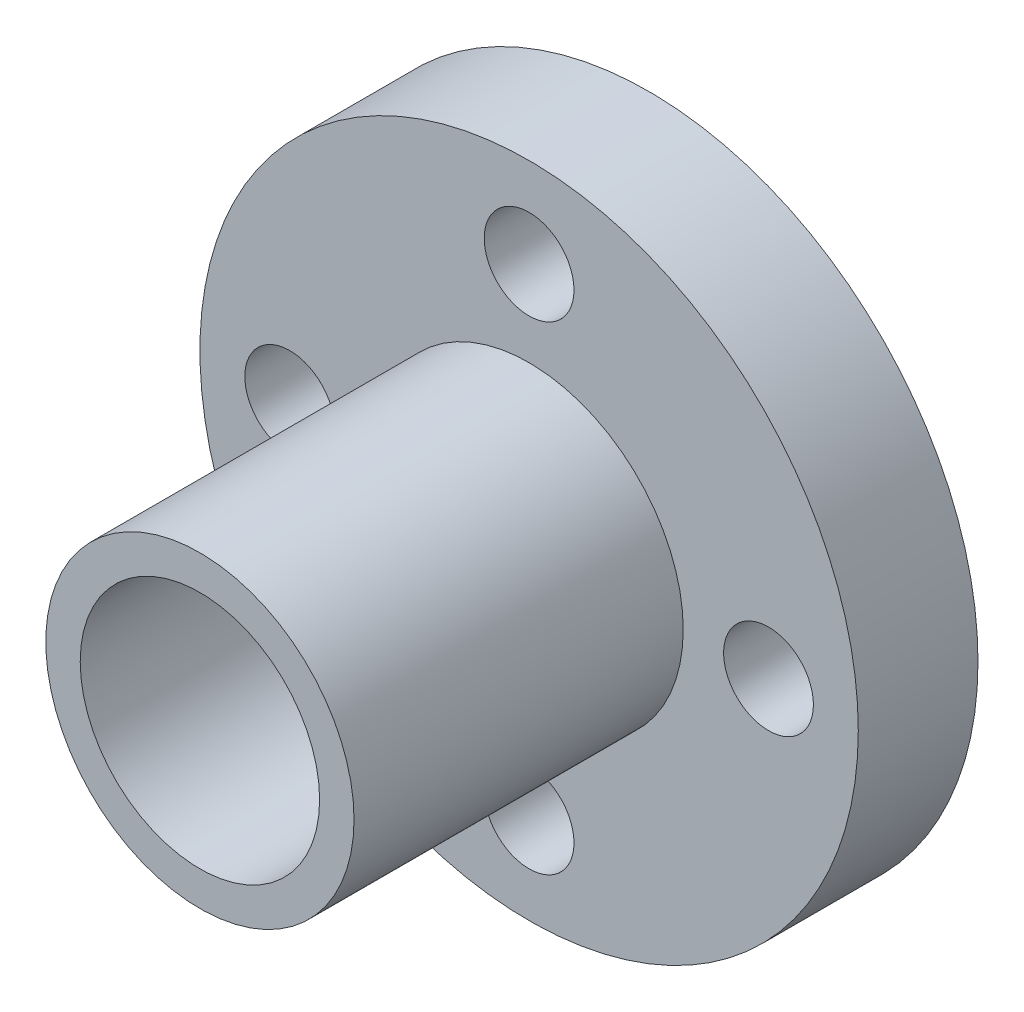
ISO-10303-21;
HEADER;
FILE_DESCRIPTION(('STEP AP214'),'2;1');
FILE_NAME('part.step','',(''),(''),'','','');
FILE_SCHEMA(('AUTOMOTIVE_DESIGN { 1 0 10303 214 1 1 1 1 }'));
ENDSEC;
DATA;
#1=APPLICATION_CONTEXT('core data for automotive mechanical design processes');
#2=APPLICATION_PROTOCOL_DEFINITION('international standard','automotive_design',2000,#1);
#3=PRODUCT_CONTEXT('',#1,'mechanical');
#4=PRODUCT('Part','Part','',(#3));
#5=PRODUCT_RELATED_PRODUCT_CATEGORY('part','',(#4));
#6=PRODUCT_DEFINITION_FORMATION('','',#4);
#7=PRODUCT_DEFINITION_CONTEXT('part definition',#1,'design');
#8=PRODUCT_DEFINITION('design','',#6,#7);
#9=PRODUCT_DEFINITION_SHAPE('','',#8);
#10=(LENGTH_UNIT() NAMED_UNIT(*) SI_UNIT(.MILLI.,.METRE.));
#11=(NAMED_UNIT(*) PLANE_ANGLE_UNIT() SI_UNIT($,.RADIAN.));
#12=(NAMED_UNIT(*) SI_UNIT($,.STERADIAN.) SOLID_ANGLE_UNIT());
#13=UNCERTAINTY_MEASURE_WITH_UNIT(LENGTH_MEASURE(1.E-05),#10,'distance_accuracy_value','');
#14=(GEOMETRIC_REPRESENTATION_CONTEXT(3) GLOBAL_UNCERTAINTY_ASSIGNED_CONTEXT((#13)) GLOBAL_UNIT_ASSIGNED_CONTEXT((#10,
#11,#12)) REPRESENTATION_CONTEXT('',''));
#15=CARTESIAN_POINT('',(0.,0.,0.));
#16=DIRECTION('',(0.,0.,1.));
#17=DIRECTION('',(1.,0.,0.));
#18=AXIS2_PLACEMENT_3D('',#15,#16,#17);
#19=CARTESIAN_POINT('',(0.,0.,4.));
#20=DIRECTION('',(0.,0.,-1.));
#21=DIRECTION('',(-1.,0.,0.));
#22=AXIS2_PLACEMENT_3D('',#19,#20,#21);
#23=CYLINDRICAL_SURFACE('',#22,11.);
#24=CARTESIAN_POINT('',(0.,0.,4.));
#25=DIRECTION('',(0.,0.,1.));
#26=DIRECTION('',(1.,0.,0.));
#27=AXIS2_PLACEMENT_3D('',#24,#25,#26);
#28=CIRCLE('',#27,11.);
#29=CARTESIAN_POINT('',(11.,0.,4.));
#30=VERTEX_POINT('',#29);
#31=EDGE_CURVE('E39',#30,#30,#28,.T.);
#32=ORIENTED_EDGE('',*,*,#31,.F.);
#33=EDGE_LOOP('',(#32));
#34=FACE_BOUND('',#33,.T.);
#35=CARTESIAN_POINT('',(0.,0.,0.));
#36=DIRECTION('',(0.,0.,1.));
#37=DIRECTION('',(1.,0.,0.));
#38=AXIS2_PLACEMENT_3D('',#35,#36,#37);
#39=CIRCLE('',#38,11.);
#40=CARTESIAN_POINT('',(11.,0.,0.));
#41=VERTEX_POINT('',#40);
#42=EDGE_CURVE('E35',#41,#41,#39,.T.);
#43=ORIENTED_EDGE('',*,*,#42,.T.);
#44=EDGE_LOOP('',(#43));
#45=FACE_BOUND('',#44,.T.);
#46=ADVANCED_FACE('F32',(#34,#45),#23,.T.);
#47=CARTESIAN_POINT('',(0.,0.,4.));
#48=DIRECTION('',(0.,0.,1.));
#49=DIRECTION('',(1.,0.,0.));
#50=AXIS2_PLACEMENT_3D('',#47,#48,#49);
#51=PLANE('',#50);
#52=CARTESIAN_POINT('',(0.,8.,4.));
#53=DIRECTION('',(0.,0.,1.));
#54=DIRECTION('',(1.,0.,0.));
#55=AXIS2_PLACEMENT_3D('',#52,#53,#54);
#56=CIRCLE('',#55,1.5);
#57=CARTESIAN_POINT('',(1.5,8.,4.));
#58=VERTEX_POINT('',#57);
#59=EDGE_CURVE('E73',#58,#58,#56,.T.);
#60=ORIENTED_EDGE('',*,*,#59,.F.);
#61=EDGE_LOOP('',(#60));
#62=FACE_BOUND('',#61,.T.);
#63=CARTESIAN_POINT('',(8.,0.,4.));
#64=DIRECTION('',(0.,0.,1.));
#65=DIRECTION('',(1.,0.,0.));
#66=AXIS2_PLACEMENT_3D('',#63,#64,#65);
#67=CIRCLE('',#66,1.5);
#68=CARTESIAN_POINT('',(9.5,0.,4.));
#69=VERTEX_POINT('',#68);
#70=EDGE_CURVE('E67',#69,#69,#67,.T.);
#71=ORIENTED_EDGE('',*,*,#70,.F.);
#72=EDGE_LOOP('',(#71));
#73=FACE_BOUND('',#72,.T.);
#74=CARTESIAN_POINT('',(0.,-8.,4.));
#75=DIRECTION('',(0.,0.,1.));
#76=DIRECTION('',(1.,0.,0.));
#77=AXIS2_PLACEMENT_3D('',#74,#75,#76);
#78=CIRCLE('',#77,1.5);
#79=CARTESIAN_POINT('',(1.49999999999994,-8.,4.));
#80=VERTEX_POINT('',#79);
#81=EDGE_CURVE('E61',#80,#80,#78,.T.);
#82=ORIENTED_EDGE('',*,*,#81,.F.);
#83=EDGE_LOOP('',(#82));
#84=FACE_BOUND('',#83,.T.);
#85=CARTESIAN_POINT('',(-8.,0.,4.));
#86=DIRECTION('',(0.,0.,1.));
#87=DIRECTION('',(1.,0.,0.));
#88=AXIS2_PLACEMENT_3D('',#85,#86,#87);
#89=CIRCLE('',#88,1.5);
#90=CARTESIAN_POINT('',(-6.5,0.,4.));
#91=VERTEX_POINT('',#90);
#92=EDGE_CURVE('E55',#91,#91,#89,.T.);
#93=ORIENTED_EDGE('',*,*,#92,.F.);
#94=EDGE_LOOP('',(#93));
#95=FACE_BOUND('',#94,.T.);
#96=CARTESIAN_POINT('',(0.,0.,4.));
#97=DIRECTION('',(0.,0.,1.));
#98=DIRECTION('',(1.,0.,0.));
#99=AXIS2_PLACEMENT_3D('',#96,#97,#98);
#100=CIRCLE('',#99,5.15);
#101=CARTESIAN_POINT('',(5.15,0.,4.));
#102=VERTEX_POINT('',#101);
#103=EDGE_CURVE('E10',#102,#102,#100,.T.);
#104=ORIENTED_EDGE('',*,*,#103,.F.);
#105=EDGE_LOOP('',(#104));
#106=FACE_BOUND('',#105,.T.);
#107=ORIENTED_EDGE('',*,*,#31,.T.);
#108=EDGE_LOOP('',(#107));
#109=FACE_BOUND('',#108,.T.);
#110=ADVANCED_FACE('F89',(#62,#73,#84,#95,#106,#109),#51,.T.);
#111=CARTESIAN_POINT('',(0.,0.,0.));
#112=DIRECTION('',(0.,0.,1.));
#113=DIRECTION('',(1.,0.,0.));
#114=AXIS2_PLACEMENT_3D('',#111,#112,#113);
#115=PLANE('',#114);
#116=CARTESIAN_POINT('',(0.,8.,0.));
#117=DIRECTION('',(0.,0.,1.));
#118=DIRECTION('',(1.,0.,0.));
#119=AXIS2_PLACEMENT_3D('',#116,#117,#118);
#120=CIRCLE('',#119,1.5);
#121=CARTESIAN_POINT('',(1.5,8.,0.));
#122=VERTEX_POINT('',#121);
#123=EDGE_CURVE('E52',#122,#122,#120,.T.);
#124=ORIENTED_EDGE('',*,*,#123,.T.);
#125=EDGE_LOOP('',(#124));
#126=FACE_BOUND('',#125,.T.);
#127=CARTESIAN_POINT('',(8.,0.,0.));
#128=DIRECTION('',(0.,0.,1.));
#129=DIRECTION('',(1.,0.,0.));
#130=AXIS2_PLACEMENT_3D('',#127,#128,#129);
#131=CIRCLE('',#130,1.5);
#132=CARTESIAN_POINT('',(9.5,0.,0.));
#133=VERTEX_POINT('',#132);
#134=EDGE_CURVE('E70',#133,#133,#131,.T.);
#135=ORIENTED_EDGE('',*,*,#134,.T.);
#136=EDGE_LOOP('',(#135));
#137=FACE_BOUND('',#136,.T.);
#138=CARTESIAN_POINT('',(0.,-8.,0.));
#139=DIRECTION('',(0.,0.,1.));
#140=DIRECTION('',(1.,0.,0.));
#141=AXIS2_PLACEMENT_3D('',#138,#139,#140);
#142=CIRCLE('',#141,1.5);
#143=CARTESIAN_POINT('',(1.49999999999994,-8.,0.));
#144=VERTEX_POINT('',#143);
#145=EDGE_CURVE('E64',#144,#144,#142,.T.);
#146=ORIENTED_EDGE('',*,*,#145,.T.);
#147=EDGE_LOOP('',(#146));
#148=FACE_BOUND('',#147,.T.);
#149=CARTESIAN_POINT('',(-8.,0.,0.));
#150=DIRECTION('',(0.,0.,1.));
#151=DIRECTION('',(1.,0.,0.));
#152=AXIS2_PLACEMENT_3D('',#149,#150,#151);
#153=CIRCLE('',#152,1.5);
#154=CARTESIAN_POINT('',(-6.5,0.,0.));
#155=VERTEX_POINT('',#154);
#156=EDGE_CURVE('E58',#155,#155,#153,.T.);
#157=ORIENTED_EDGE('',*,*,#156,.T.);
#158=EDGE_LOOP('',(#157));
#159=FACE_BOUND('',#158,.T.);
#160=CARTESIAN_POINT('',(0.,0.,0.));
#161=DIRECTION('',(0.,0.,1.));
#162=DIRECTION('',(1.,0.,0.));
#163=AXIS2_PLACEMENT_3D('',#160,#161,#162);
#164=CIRCLE('',#163,4.);
#165=CARTESIAN_POINT('',(4.,0.,0.));
#166=VERTEX_POINT('',#165);
#167=EDGE_CURVE('E48',#166,#166,#164,.T.);
#168=ORIENTED_EDGE('',*,*,#167,.T.);
#169=EDGE_LOOP('',(#168));
#170=FACE_BOUND('',#169,.T.);
#171=ORIENTED_EDGE('',*,*,#42,.F.);
#172=EDGE_LOOP('',(#171));
#173=FACE_BOUND('',#172,.T.);
#174=ADVANCED_FACE('F79',(#126,#137,#148,#159,#170,#173),#115,.F.);
#175=CARTESIAN_POINT('',(0.,0.,15.));
#176=DIRECTION('',(0.,0.,-1.));
#177=DIRECTION('',(-1.,0.,0.));
#178=AXIS2_PLACEMENT_3D('',#175,#176,#177);
#179=CYLINDRICAL_SURFACE('',#178,5.15);
#180=CARTESIAN_POINT('',(0.,0.,15.));
#181=DIRECTION('',(0.,0.,1.));
#182=DIRECTION('',(1.,0.,0.));
#183=AXIS2_PLACEMENT_3D('',#180,#181,#182);
#184=CIRCLE('',#183,5.15);
#185=CARTESIAN_POINT('',(5.15,0.,15.));
#186=VERTEX_POINT('',#185);
#187=EDGE_CURVE('E45',#186,#186,#184,.T.);
#188=ORIENTED_EDGE('',*,*,#187,.F.);
#189=EDGE_LOOP('',(#188));
#190=FACE_BOUND('',#189,.T.);
#191=ORIENTED_EDGE('',*,*,#103,.T.);
#192=EDGE_LOOP('',(#191));
#193=FACE_BOUND('',#192,.T.);
#194=ADVANCED_FACE('F108',(#190,#193),#179,.T.);
#195=CARTESIAN_POINT('',(0.,0.,15.));
#196=DIRECTION('',(0.,0.,1.));
#197=DIRECTION('',(1.,0.,0.));
#198=AXIS2_PLACEMENT_3D('',#195,#196,#197);
#199=PLANE('',#198);
#200=CARTESIAN_POINT('',(0.,0.,15.));
#201=DIRECTION('',(0.,0.,1.));
#202=DIRECTION('',(1.,0.,0.));
#203=AXIS2_PLACEMENT_3D('',#200,#201,#202);
#204=CIRCLE('',#203,4.);
#205=CARTESIAN_POINT('',(4.,0.,15.));
#206=VERTEX_POINT('',#205);
#207=EDGE_CURVE('E49',#206,#206,#204,.T.);
#208=ORIENTED_EDGE('',*,*,#207,.F.);
#209=EDGE_LOOP('',(#208));
#210=FACE_BOUND('',#209,.T.);
#211=ORIENTED_EDGE('',*,*,#187,.T.);
#212=EDGE_LOOP('',(#211));
#213=FACE_BOUND('',#212,.T.);
#214=ADVANCED_FACE('F112',(#210,#213),#199,.T.);
#215=CARTESIAN_POINT('',(0.,0.,0.));
#216=DIRECTION('',(0.,0.,1.));
#217=DIRECTION('',(1.,0.,0.));
#218=AXIS2_PLACEMENT_3D('',#215,#216,#217);
#219=CYLINDRICAL_SURFACE('',#218,4.);
#220=ORIENTED_EDGE('',*,*,#167,.F.);
#221=EDGE_LOOP('',(#220));
#222=FACE_BOUND('',#221,.T.);
#223=ORIENTED_EDGE('',*,*,#207,.T.);
#224=EDGE_LOOP('',(#223));
#225=FACE_BOUND('',#224,.T.);
#226=ADVANCED_FACE('F118',(#222,#225),#219,.F.);
#227=CARTESIAN_POINT('',(-8.,0.,0.));
#228=DIRECTION('',(0.,0.,1.));
#229=DIRECTION('',(1.,0.,0.));
#230=AXIS2_PLACEMENT_3D('',#227,#228,#229);
#231=CYLINDRICAL_SURFACE('',#230,1.5);
#232=ORIENTED_EDGE('',*,*,#156,.F.);
#233=EDGE_LOOP('',(#232));
#234=FACE_BOUND('',#233,.T.);
#235=ORIENTED_EDGE('',*,*,#92,.T.);
#236=EDGE_LOOP('',(#235));
#237=FACE_BOUND('',#236,.T.);
#238=ADVANCED_FACE('F122',(#234,#237),#231,.F.);
#239=CARTESIAN_POINT('',(0.,-8.,0.));
#240=DIRECTION('',(0.,0.,1.));
#241=DIRECTION('',(1.,0.,0.));
#242=AXIS2_PLACEMENT_3D('',#239,#240,#241);
#243=CYLINDRICAL_SURFACE('',#242,1.5);
#244=ORIENTED_EDGE('',*,*,#145,.F.);
#245=EDGE_LOOP('',(#244));
#246=FACE_BOUND('',#245,.T.);
#247=ORIENTED_EDGE('',*,*,#81,.T.);
#248=EDGE_LOOP('',(#247));
#249=FACE_BOUND('',#248,.T.);
#250=ADVANCED_FACE('F126',(#246,#249),#243,.F.);
#251=CARTESIAN_POINT('',(8.,0.,0.));
#252=DIRECTION('',(0.,0.,1.));
#253=DIRECTION('',(1.,0.,0.));
#254=AXIS2_PLACEMENT_3D('',#251,#252,#253);
#255=CYLINDRICAL_SURFACE('',#254,1.5);
#256=ORIENTED_EDGE('',*,*,#134,.F.);
#257=EDGE_LOOP('',(#256));
#258=FACE_BOUND('',#257,.T.);
#259=ORIENTED_EDGE('',*,*,#70,.T.);
#260=EDGE_LOOP('',(#259));
#261=FACE_BOUND('',#260,.T.);
#262=ADVANCED_FACE('F85',(#258,#261),#255,.F.);
#263=CARTESIAN_POINT('',(0.,8.,0.));
#264=DIRECTION('',(0.,0.,1.));
#265=DIRECTION('',(1.,0.,0.));
#266=AXIS2_PLACEMENT_3D('',#263,#264,#265);
#267=CYLINDRICAL_SURFACE('',#266,1.5);
#268=ORIENTED_EDGE('',*,*,#123,.F.);
#269=EDGE_LOOP('',(#268));
#270=FACE_BOUND('',#269,.T.);
#271=ORIENTED_EDGE('',*,*,#59,.T.);
#272=EDGE_LOOP('',(#271));
#273=FACE_BOUND('',#272,.T.);
#274=ADVANCED_FACE('F82',(#270,#273),#267,.F.);
#275=CLOSED_SHELL('',(#46,#110,#174,#194,#214,#226,#238,#250,#262,#274));
#276=MANIFOLD_SOLID_BREP('B2',#275);
#277=ADVANCED_BREP_SHAPE_REPRESENTATION('',(#18,#276),#14);
#278=SHAPE_DEFINITION_REPRESENTATION(#9,#277);
ENDSEC;
END-ISO-10303-21;
